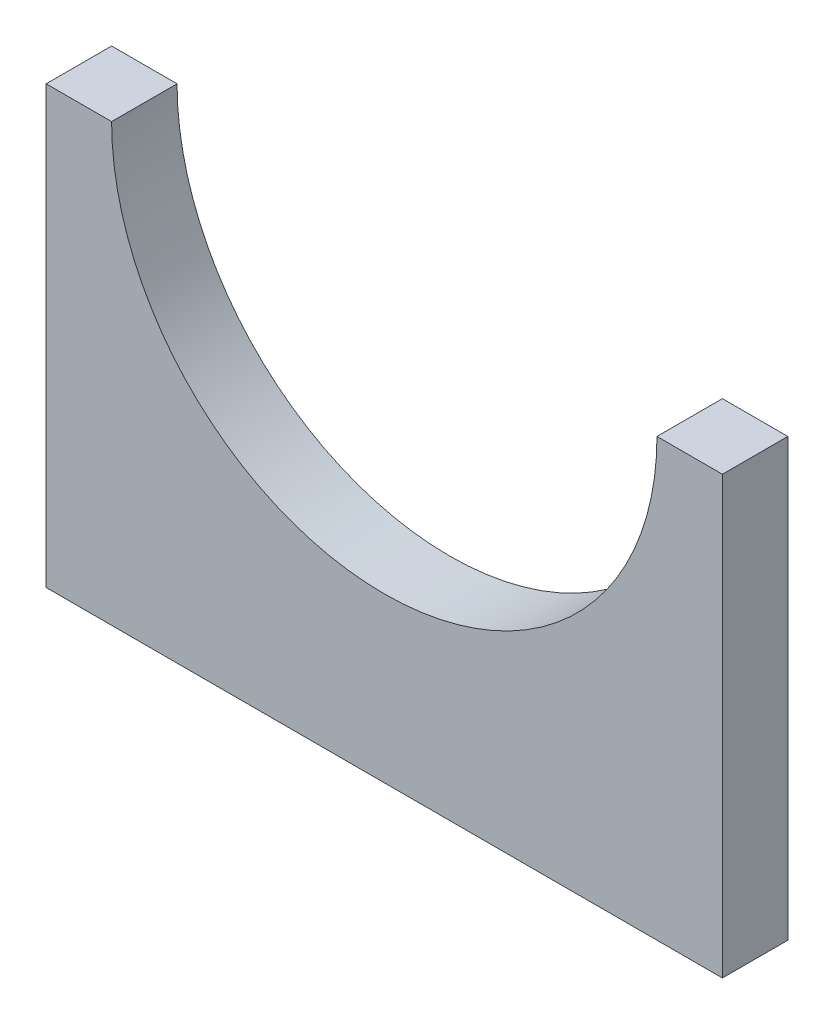
ISO-10303-21;
HEADER;
FILE_DESCRIPTION(('STEP AP214'),'2;1');
FILE_NAME('part.step','',(''),(''),'','','');
FILE_SCHEMA(('AUTOMOTIVE_DESIGN { 1 0 10303 214 1 1 1 1 }'));
ENDSEC;
DATA;
#1=APPLICATION_CONTEXT('core data for automotive mechanical design processes');
#2=APPLICATION_PROTOCOL_DEFINITION('international standard','automotive_design',2000,#1);
#3=PRODUCT_CONTEXT('',#1,'mechanical');
#4=PRODUCT('Part','Part','',(#3));
#5=PRODUCT_RELATED_PRODUCT_CATEGORY('part','',(#4));
#6=PRODUCT_DEFINITION_FORMATION('','',#4);
#7=PRODUCT_DEFINITION_CONTEXT('part definition',#1,'design');
#8=PRODUCT_DEFINITION('design','',#6,#7);
#9=PRODUCT_DEFINITION_SHAPE('','',#8);
#10=(LENGTH_UNIT() NAMED_UNIT(*) SI_UNIT(.MILLI.,.METRE.));
#11=(NAMED_UNIT(*) PLANE_ANGLE_UNIT() SI_UNIT($,.RADIAN.));
#12=(NAMED_UNIT(*) SI_UNIT($,.STERADIAN.) SOLID_ANGLE_UNIT());
#13=UNCERTAINTY_MEASURE_WITH_UNIT(LENGTH_MEASURE(1.E-05),#10,'distance_accuracy_value','');
#14=(GEOMETRIC_REPRESENTATION_CONTEXT(3) GLOBAL_UNCERTAINTY_ASSIGNED_CONTEXT((#13)) GLOBAL_UNIT_ASSIGNED_CONTEXT((#10,
#11,#12)) REPRESENTATION_CONTEXT('',''));
#15=CARTESIAN_POINT('',(0.,0.,0.));
#16=DIRECTION('',(0.,0.,1.));
#17=DIRECTION('',(1.,0.,0.));
#18=AXIS2_PLACEMENT_3D('',#15,#16,#17);
#19=CARTESIAN_POINT('',(0.,0.,1.5));
#20=DIRECTION('',(0.,0.,-1.));
#21=DIRECTION('',(-1.,0.,0.));
#22=AXIS2_PLACEMENT_3D('',#19,#20,#21);
#23=CYLINDRICAL_SURFACE('',#22,12.5);
#24=CARTESIAN_POINT('',(0.,0.,-1.5));
#25=DIRECTION('',(0.,0.,-1.));
#26=DIRECTION('',(1.,0.,0.));
#27=AXIS2_PLACEMENT_3D('',#24,#25,#26);
#28=CIRCLE('',#27,12.5);
#29=CARTESIAN_POINT('',(12.5,0.,-1.5));
#30=VERTEX_POINT('',#29);
#31=CARTESIAN_POINT('',(-12.5,0.,-1.5));
#32=VERTEX_POINT('',#31);
#33=EDGE_CURVE('E117',#30,#32,#28,.T.);
#34=ORIENTED_EDGE('',*,*,#33,.T.);
#35=DIRECTION('',(0.,0.,-1.));
#36=VECTOR('',#35,1.);
#37=CARTESIAN_POINT('',(-12.5,0.,1.5));
#38=LINE('',#37,#36);
#39=CARTESIAN_POINT('',(-12.5,0.,1.5));
#40=VERTEX_POINT('',#39);
#41=EDGE_CURVE('E11',#40,#32,#38,.T.);
#42=ORIENTED_EDGE('',*,*,#41,.F.);
#43=CARTESIAN_POINT('',(0.,0.,1.5));
#44=DIRECTION('',(0.,0.,-1.));
#45=DIRECTION('',(1.,0.,0.));
#46=AXIS2_PLACEMENT_3D('',#43,#44,#45);
#47=CIRCLE('',#46,12.5);
#48=CARTESIAN_POINT('',(12.5,0.,1.5));
#49=VERTEX_POINT('',#48);
#50=EDGE_CURVE('E127',#49,#40,#47,.T.);
#51=ORIENTED_EDGE('',*,*,#50,.F.);
#52=DIRECTION('',(0.,0.,-1.));
#53=VECTOR('',#52,1.);
#54=CARTESIAN_POINT('',(12.5,0.,1.5));
#55=LINE('',#54,#53);
#56=EDGE_CURVE('E113',#49,#30,#55,.T.);
#57=ORIENTED_EDGE('',*,*,#56,.T.);
#58=EDGE_LOOP('',(#34,#42,#51,#57));
#59=FACE_BOUND('',#58,.T.);
#60=ADVANCED_FACE('F33',(#59),#23,.F.);
#61=CARTESIAN_POINT('',(-15.5,0.,1.5));
#62=DIRECTION('',(0.,-1.,0.));
#63=DIRECTION('',(0.,0.,-1.));
#64=AXIS2_PLACEMENT_3D('',#61,#62,#63);
#65=PLANE('',#64);
#66=DIRECTION('',(-1.,0.,0.));
#67=VECTOR('',#66,1.);
#68=CARTESIAN_POINT('',(-15.5,0.,-1.5));
#69=LINE('',#68,#67);
#70=CARTESIAN_POINT('',(-15.5,0.,-1.5));
#71=VERTEX_POINT('',#70);
#72=EDGE_CURVE('E120',#32,#71,#69,.T.);
#73=ORIENTED_EDGE('',*,*,#72,.T.);
#74=DIRECTION('',(0.,0.,-1.));
#75=VECTOR('',#74,1.);
#76=CARTESIAN_POINT('',(-15.5,0.,1.5));
#77=LINE('',#76,#75);
#78=CARTESIAN_POINT('',(-15.5,0.,1.5));
#79=VERTEX_POINT('',#78);
#80=EDGE_CURVE('E41',#79,#71,#77,.T.);
#81=ORIENTED_EDGE('',*,*,#80,.F.);
#82=DIRECTION('',(-1.,0.,0.));
#83=VECTOR('',#82,1.);
#84=CARTESIAN_POINT('',(-15.5,0.,1.5));
#85=LINE('',#84,#83);
#86=EDGE_CURVE('E86',#40,#79,#85,.T.);
#87=ORIENTED_EDGE('',*,*,#86,.F.);
#88=ORIENTED_EDGE('',*,*,#41,.T.);
#89=EDGE_LOOP('',(#73,#81,#87,#88));
#90=FACE_BOUND('',#89,.T.);
#91=ADVANCED_FACE('F151',(#90),#65,.F.);
#92=CARTESIAN_POINT('',(-15.5,-20.,1.5));
#93=DIRECTION('',(1.,0.,0.));
#94=DIRECTION('',(0.,0.,-1.));
#95=AXIS2_PLACEMENT_3D('',#92,#93,#94);
#96=PLANE('',#95);
#97=DIRECTION('',(0.,-1.,0.));
#98=VECTOR('',#97,1.);
#99=CARTESIAN_POINT('',(-15.5,-20.,-1.5));
#100=LINE('',#99,#98);
#101=CARTESIAN_POINT('',(-15.5,-20.,-1.5));
#102=VERTEX_POINT('',#101);
#103=EDGE_CURVE('E122',#71,#102,#100,.T.);
#104=ORIENTED_EDGE('',*,*,#103,.T.);
#105=DIRECTION('',(0.,0.,-1.));
#106=VECTOR('',#105,1.);
#107=CARTESIAN_POINT('',(-15.5,-20.,1.5));
#108=LINE('',#107,#106);
#109=CARTESIAN_POINT('',(-15.5,-20.,1.5));
#110=VERTEX_POINT('',#109);
#111=EDGE_CURVE('E108',#110,#102,#108,.T.);
#112=ORIENTED_EDGE('',*,*,#111,.F.);
#113=DIRECTION('',(0.,-1.,0.));
#114=VECTOR('',#113,1.);
#115=CARTESIAN_POINT('',(-15.5,-20.,1.5));
#116=LINE('',#115,#114);
#117=EDGE_CURVE('E99',#79,#110,#116,.T.);
#118=ORIENTED_EDGE('',*,*,#117,.F.);
#119=ORIENTED_EDGE('',*,*,#80,.T.);
#120=EDGE_LOOP('',(#104,#112,#118,#119));
#121=FACE_BOUND('',#120,.T.);
#122=ADVANCED_FACE('F133',(#121),#96,.F.);
#123=CARTESIAN_POINT('',(15.5,-20.,1.5));
#124=DIRECTION('',(0.,1.,0.));
#125=DIRECTION('',(-1.,0.,0.));
#126=AXIS2_PLACEMENT_3D('',#123,#124,#125);
#127=PLANE('',#126);
#128=DIRECTION('',(1.,0.,0.));
#129=VECTOR('',#128,1.);
#130=CARTESIAN_POINT('',(15.5,-20.,-1.5));
#131=LINE('',#130,#129);
#132=CARTESIAN_POINT('',(15.5,-20.,-1.5));
#133=VERTEX_POINT('',#132);
#134=EDGE_CURVE('E107',#102,#133,#131,.T.);
#135=ORIENTED_EDGE('',*,*,#134,.T.);
#136=DIRECTION('',(0.,0.,-1.));
#137=VECTOR('',#136,1.);
#138=CARTESIAN_POINT('',(15.5,-20.,1.5));
#139=LINE('',#138,#137);
#140=CARTESIAN_POINT('',(15.5,-20.,1.5));
#141=VERTEX_POINT('',#140);
#142=EDGE_CURVE('E104',#141,#133,#139,.T.);
#143=ORIENTED_EDGE('',*,*,#142,.F.);
#144=DIRECTION('',(1.,0.,0.));
#145=VECTOR('',#144,1.);
#146=CARTESIAN_POINT('',(15.5,-20.,1.5));
#147=LINE('',#146,#145);
#148=EDGE_CURVE('E93',#110,#141,#147,.T.);
#149=ORIENTED_EDGE('',*,*,#148,.F.);
#150=ORIENTED_EDGE('',*,*,#111,.T.);
#151=EDGE_LOOP('',(#135,#143,#149,#150));
#152=FACE_BOUND('',#151,.T.);
#153=ADVANCED_FACE('F105',(#152),#127,.F.);
#154=CARTESIAN_POINT('',(15.5,0.,1.5));
#155=DIRECTION('',(-1.,0.,0.));
#156=DIRECTION('',(0.,-1.,0.));
#157=AXIS2_PLACEMENT_3D('',#154,#155,#156);
#158=PLANE('',#157);
#159=DIRECTION('',(0.,1.,0.));
#160=VECTOR('',#159,1.);
#161=CARTESIAN_POINT('',(15.5,0.,-1.5));
#162=LINE('',#161,#160);
#163=CARTESIAN_POINT('',(15.5,0.,-1.5));
#164=VERTEX_POINT('',#163);
#165=EDGE_CURVE('E72',#133,#164,#162,.T.);
#166=ORIENTED_EDGE('',*,*,#165,.T.);
#167=DIRECTION('',(0.,0.,-1.));
#168=VECTOR('',#167,1.);
#169=CARTESIAN_POINT('',(15.5,0.,1.5));
#170=LINE('',#169,#168);
#171=CARTESIAN_POINT('',(15.5,0.,1.5));
#172=VERTEX_POINT('',#171);
#173=EDGE_CURVE('E109',#172,#164,#170,.T.);
#174=ORIENTED_EDGE('',*,*,#173,.F.);
#175=DIRECTION('',(0.,1.,0.));
#176=VECTOR('',#175,1.);
#177=CARTESIAN_POINT('',(15.5,0.,1.5));
#178=LINE('',#177,#176);
#179=EDGE_CURVE('E97',#141,#172,#178,.T.);
#180=ORIENTED_EDGE('',*,*,#179,.F.);
#181=ORIENTED_EDGE('',*,*,#142,.T.);
#182=EDGE_LOOP('',(#166,#174,#180,#181));
#183=FACE_BOUND('',#182,.T.);
#184=ADVANCED_FACE('F111',(#183),#158,.F.);
#185=CARTESIAN_POINT('',(12.5,0.,1.5));
#186=DIRECTION('',(0.,-1.,0.));
#187=DIRECTION('',(0.,0.,-1.));
#188=AXIS2_PLACEMENT_3D('',#185,#186,#187);
#189=PLANE('',#188);
#190=DIRECTION('',(-1.,0.,0.));
#191=VECTOR('',#190,1.);
#192=CARTESIAN_POINT('',(12.5,0.,-1.5));
#193=LINE('',#192,#191);
#194=EDGE_CURVE('E78',#164,#30,#193,.T.);
#195=ORIENTED_EDGE('',*,*,#194,.T.);
#196=ORIENTED_EDGE('',*,*,#56,.F.);
#197=DIRECTION('',(-1.,0.,0.));
#198=VECTOR('',#197,1.);
#199=CARTESIAN_POINT('',(12.5,0.,1.5));
#200=LINE('',#199,#198);
#201=EDGE_CURVE('E49',#172,#49,#200,.T.);
#202=ORIENTED_EDGE('',*,*,#201,.F.);
#203=ORIENTED_EDGE('',*,*,#173,.T.);
#204=EDGE_LOOP('',(#195,#196,#202,#203));
#205=FACE_BOUND('',#204,.T.);
#206=ADVANCED_FACE('F140',(#205),#189,.F.);
#207=CARTESIAN_POINT('',(0.,0.,1.5));
#208=DIRECTION('',(0.,0.,1.));
#209=DIRECTION('',(1.,0.,0.));
#210=AXIS2_PLACEMENT_3D('',#207,#208,#209);
#211=PLANE('',#210);
#212=ORIENTED_EDGE('',*,*,#50,.T.);
#213=ORIENTED_EDGE('',*,*,#86,.T.);
#214=ORIENTED_EDGE('',*,*,#117,.T.);
#215=ORIENTED_EDGE('',*,*,#148,.T.);
#216=ORIENTED_EDGE('',*,*,#179,.T.);
#217=ORIENTED_EDGE('',*,*,#201,.T.);
#218=EDGE_LOOP('',(#212,#213,#214,#215,#216,#217));
#219=FACE_BOUND('',#218,.T.);
#220=ADVANCED_FACE('F95',(#219),#211,.T.);
#221=CARTESIAN_POINT('',(0.,0.,-1.5));
#222=DIRECTION('',(0.,0.,1.));
#223=DIRECTION('',(1.,0.,0.));
#224=AXIS2_PLACEMENT_3D('',#221,#222,#223);
#225=PLANE('',#224);
#226=ORIENTED_EDGE('',*,*,#33,.F.);
#227=ORIENTED_EDGE('',*,*,#194,.F.);
#228=ORIENTED_EDGE('',*,*,#165,.F.);
#229=ORIENTED_EDGE('',*,*,#134,.F.);
#230=ORIENTED_EDGE('',*,*,#103,.F.);
#231=ORIENTED_EDGE('',*,*,#72,.F.);
#232=EDGE_LOOP('',(#226,#227,#228,#229,#230,#231));
#233=FACE_BOUND('',#232,.T.);
#234=ADVANCED_FACE('F136',(#233),#225,.F.);
#235=CLOSED_SHELL('',(#60,#91,#122,#153,#184,#206,#220,#234));
#236=MANIFOLD_SOLID_BREP('B2',#235);
#237=ADVANCED_BREP_SHAPE_REPRESENTATION('',(#18,#236),#14);
#238=SHAPE_DEFINITION_REPRESENTATION(#9,#237);
ENDSEC;
END-ISO-10303-21;
